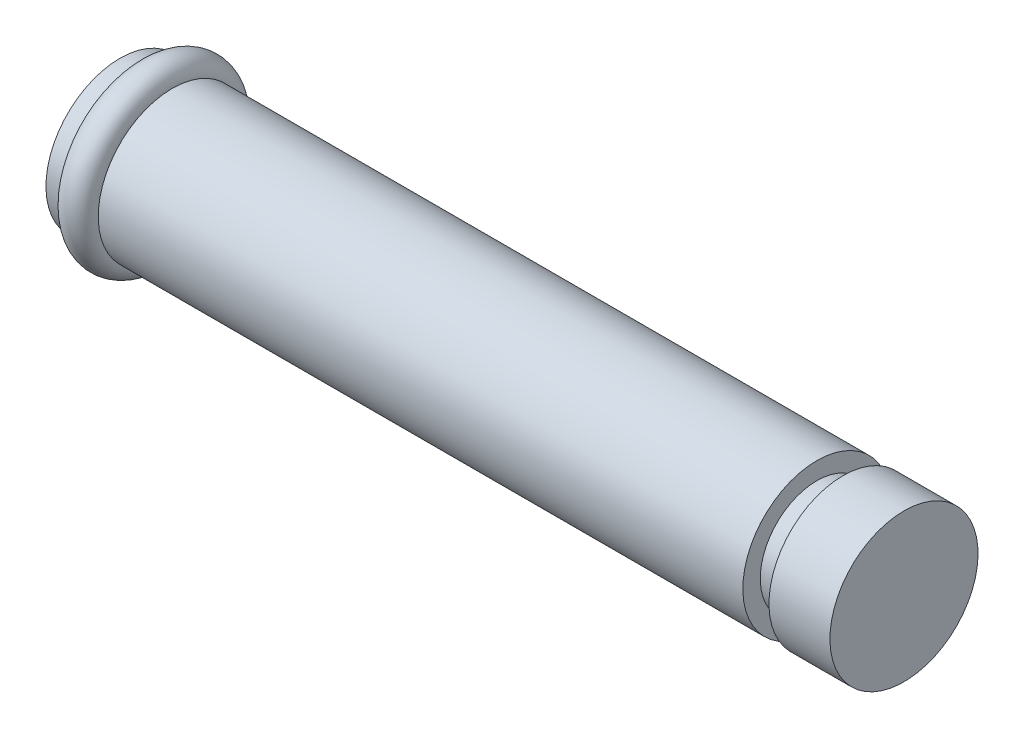
ISO-10303-21;
HEADER;
FILE_DESCRIPTION(('STEP AP214'),'2;1');
FILE_NAME('part.step','',(''),(''),'','','');
FILE_SCHEMA(('AUTOMOTIVE_DESIGN { 1 0 10303 214 1 1 1 1 }'));
ENDSEC;
DATA;
#1=APPLICATION_CONTEXT('core data for automotive mechanical design processes');
#2=APPLICATION_PROTOCOL_DEFINITION('international standard','automotive_design',2000,#1);
#3=PRODUCT_CONTEXT('',#1,'mechanical');
#4=PRODUCT('Part','Part','',(#3));
#5=PRODUCT_RELATED_PRODUCT_CATEGORY('part','',(#4));
#6=PRODUCT_DEFINITION_FORMATION('','',#4);
#7=PRODUCT_DEFINITION_CONTEXT('part definition',#1,'design');
#8=PRODUCT_DEFINITION('design','',#6,#7);
#9=PRODUCT_DEFINITION_SHAPE('','',#8);
#10=(LENGTH_UNIT() NAMED_UNIT(*) SI_UNIT(.MILLI.,.METRE.));
#11=(NAMED_UNIT(*) PLANE_ANGLE_UNIT() SI_UNIT($,.RADIAN.));
#12=(NAMED_UNIT(*) SI_UNIT($,.STERADIAN.) SOLID_ANGLE_UNIT());
#13=UNCERTAINTY_MEASURE_WITH_UNIT(LENGTH_MEASURE(1.E-05),#10,'distance_accuracy_value','');
#14=(GEOMETRIC_REPRESENTATION_CONTEXT(3) GLOBAL_UNCERTAINTY_ASSIGNED_CONTEXT((#13)) GLOBAL_UNIT_ASSIGNED_CONTEXT((#10,
#11,#12)) REPRESENTATION_CONTEXT('',''));
#15=CARTESIAN_POINT('',(0.,0.,0.));
#16=DIRECTION('',(0.,0.,1.));
#17=DIRECTION('',(1.,0.,0.));
#18=AXIS2_PLACEMENT_3D('',#15,#16,#17);
#19=CARTESIAN_POINT('',(-43.05,0.,0.));
#20=DIRECTION('',(-1.,0.,0.));
#21=DIRECTION('',(0.,-1.,0.));
#22=AXIS2_PLACEMENT_3D('',#19,#20,#21);
#23=TOROIDAL_SURFACE('',#22,4.2,0.925000000000002);
#24=CARTESIAN_POINT('',(-43.05,-5.12500000000001,0.));
#25=VERTEX_POINT('',#24);
#26=VERTEX_LOOP('',#25);
#27=FACE_BOUND('',#26,.T.);
#28=ADVANCED_FACE('F45',(#27),#23,.T.);
#29=CLOSED_SHELL('',(#28));
#30=MANIFOLD_SOLID_BREP('B2',#29);
#31=CARTESIAN_POINT('',(0.,0.,0.));
#32=DIRECTION('',(1.,0.,0.));
#33=DIRECTION('',(0.,1.,0.));
#34=AXIS2_PLACEMENT_3D('',#31,#32,#33);
#35=PLANE('',#34);
#36=CARTESIAN_POINT('',(0.,0.,0.));
#37=DIRECTION('',(1.,0.,0.));
#38=DIRECTION('',(0.,1.,0.));
#39=AXIS2_PLACEMENT_3D('',#36,#37,#38);
#40=CIRCLE('',#39,4.25);
#41=CARTESIAN_POINT('',(0.,4.25,0.));
#42=VERTEX_POINT('',#41);
#43=EDGE_CURVE('E44',#42,#42,#40,.T.);
#44=ORIENTED_EDGE('',*,*,#43,.T.);
#45=EDGE_LOOP('',(#44));
#46=FACE_BOUND('',#45,.T.);
#47=ADVANCED_FACE('F58',(#46),#35,.T.);
#48=CARTESIAN_POINT('',(0.,0.,0.));
#49=DIRECTION('',(1.,0.,0.));
#50=DIRECTION('',(0.,1.,0.));
#51=AXIS2_PLACEMENT_3D('',#48,#49,#50);
#52=CYLINDRICAL_SURFACE('',#51,4.25);
#53=CARTESIAN_POINT('',(-3.5,0.,0.));
#54=DIRECTION('',(1.,0.,0.));
#55=DIRECTION('',(0.,1.,0.));
#56=AXIS2_PLACEMENT_3D('',#53,#54,#55);
#57=CIRCLE('',#56,4.25);
#58=CARTESIAN_POINT('',(-3.5,4.25,0.));
#59=VERTEX_POINT('',#58);
#60=EDGE_CURVE('E65',#59,#59,#57,.T.);
#61=ORIENTED_EDGE('',*,*,#60,.T.);
#62=EDGE_LOOP('',(#61));
#63=FACE_BOUND('',#62,.T.);
#64=ORIENTED_EDGE('',*,*,#43,.F.);
#65=EDGE_LOOP('',(#64));
#66=FACE_BOUND('',#65,.T.);
#67=ADVANCED_FACE('F118',(#63,#66),#52,.T.);
#68=CARTESIAN_POINT('',(-3.5,4.25,0.));
#69=DIRECTION('',(-1.,0.,0.));
#70=DIRECTION('',(0.,-1.,0.));
#71=AXIS2_PLACEMENT_3D('',#68,#69,#70);
#72=PLANE('',#71);
#73=CARTESIAN_POINT('',(-3.5,0.,0.));
#74=DIRECTION('',(1.,0.,0.));
#75=DIRECTION('',(0.,1.,0.));
#76=AXIS2_PLACEMENT_3D('',#73,#74,#75);
#77=CIRCLE('',#76,3.25);
#78=CARTESIAN_POINT('',(-3.5,3.25,0.));
#79=VERTEX_POINT('',#78);
#80=EDGE_CURVE('E70',#79,#79,#77,.T.);
#81=ORIENTED_EDGE('',*,*,#80,.T.);
#82=EDGE_LOOP('',(#81));
#83=FACE_BOUND('',#82,.T.);
#84=ORIENTED_EDGE('',*,*,#60,.F.);
#85=EDGE_LOOP('',(#84));
#86=FACE_BOUND('',#85,.T.);
#87=ADVANCED_FACE('F122',(#83,#86),#72,.T.);
#88=CARTESIAN_POINT('',(0.,0.,0.));
#89=DIRECTION('',(1.,0.,0.));
#90=DIRECTION('',(0.,1.,0.));
#91=AXIS2_PLACEMENT_3D('',#88,#89,#90);
#92=CYLINDRICAL_SURFACE('',#91,3.25);
#93=CARTESIAN_POINT('',(-5.,0.,0.));
#94=DIRECTION('',(1.,0.,0.));
#95=DIRECTION('',(0.,1.,0.));
#96=AXIS2_PLACEMENT_3D('',#93,#94,#95);
#97=CIRCLE('',#96,3.25);
#98=CARTESIAN_POINT('',(-5.,3.25,0.));
#99=VERTEX_POINT('',#98);
#100=EDGE_CURVE('E75',#99,#99,#97,.T.);
#101=ORIENTED_EDGE('',*,*,#100,.T.);
#102=EDGE_LOOP('',(#101));
#103=FACE_BOUND('',#102,.T.);
#104=ORIENTED_EDGE('',*,*,#80,.F.);
#105=EDGE_LOOP('',(#104));
#106=FACE_BOUND('',#105,.T.);
#107=ADVANCED_FACE('F126',(#103,#106),#92,.T.);
#108=CARTESIAN_POINT('',(-5.,4.25,0.));
#109=DIRECTION('',(1.,0.,0.));
#110=DIRECTION('',(0.,1.,0.));
#111=AXIS2_PLACEMENT_3D('',#108,#109,#110);
#112=PLANE('',#111);
#113=CARTESIAN_POINT('',(-5.,0.,0.));
#114=DIRECTION('',(1.,0.,0.));
#115=DIRECTION('',(0.,1.,0.));
#116=AXIS2_PLACEMENT_3D('',#113,#114,#115);
#117=CIRCLE('',#116,4.25);
#118=CARTESIAN_POINT('',(-5.,4.25,0.));
#119=VERTEX_POINT('',#118);
#120=EDGE_CURVE('E81',#119,#119,#117,.T.);
#121=ORIENTED_EDGE('',*,*,#120,.T.);
#122=EDGE_LOOP('',(#121));
#123=FACE_BOUND('',#122,.T.);
#124=ORIENTED_EDGE('',*,*,#100,.F.);
#125=EDGE_LOOP('',(#124));
#126=FACE_BOUND('',#125,.T.);
#127=ADVANCED_FACE('F133',(#123,#126),#112,.T.);
#128=CARTESIAN_POINT('',(0.,0.,0.));
#129=DIRECTION('',(1.,0.,0.));
#130=DIRECTION('',(0.,1.,0.));
#131=AXIS2_PLACEMENT_3D('',#128,#129,#130);
#132=CYLINDRICAL_SURFACE('',#131,4.25);
#133=CARTESIAN_POINT('',(-42.,0.,0.));
#134=DIRECTION('',(1.,0.,0.));
#135=DIRECTION('',(0.,1.,0.));
#136=AXIS2_PLACEMENT_3D('',#133,#134,#135);
#137=CIRCLE('',#136,4.25);
#138=CARTESIAN_POINT('',(-42.,4.24999999999999,0.));
#139=VERTEX_POINT('',#138);
#140=EDGE_CURVE('E85',#139,#139,#137,.T.);
#141=ORIENTED_EDGE('',*,*,#140,.T.);
#142=EDGE_LOOP('',(#141));
#143=FACE_BOUND('',#142,.T.);
#144=ORIENTED_EDGE('',*,*,#120,.F.);
#145=EDGE_LOOP('',(#144));
#146=FACE_BOUND('',#145,.T.);
#147=ADVANCED_FACE('F137',(#143,#146),#132,.T.);
#148=CARTESIAN_POINT('',(-42.,4.24999999999999,0.));
#149=DIRECTION('',(-1.,0.,0.));
#150=DIRECTION('',(0.,-1.,0.));
#151=AXIS2_PLACEMENT_3D('',#148,#149,#150);
#152=PLANE('',#151);
#153=CARTESIAN_POINT('',(-42.,0.,0.));
#154=DIRECTION('',(1.,0.,0.));
#155=DIRECTION('',(0.,1.,0.));
#156=AXIS2_PLACEMENT_3D('',#153,#154,#155);
#157=CIRCLE('',#156,3.25);
#158=CARTESIAN_POINT('',(-42.,3.25,0.));
#159=VERTEX_POINT('',#158);
#160=EDGE_CURVE('E89',#159,#159,#157,.T.);
#161=ORIENTED_EDGE('',*,*,#160,.T.);
#162=EDGE_LOOP('',(#161));
#163=FACE_BOUND('',#162,.T.);
#164=ORIENTED_EDGE('',*,*,#140,.F.);
#165=EDGE_LOOP('',(#164));
#166=FACE_BOUND('',#165,.T.);
#167=ADVANCED_FACE('F141',(#163,#166),#152,.T.);
#168=CARTESIAN_POINT('',(0.,0.,0.));
#169=DIRECTION('',(1.,0.,0.));
#170=DIRECTION('',(0.,1.,0.));
#171=AXIS2_PLACEMENT_3D('',#168,#169,#170);
#172=CYLINDRICAL_SURFACE('',#171,3.25);
#173=CARTESIAN_POINT('',(-44.,0.,0.));
#174=DIRECTION('',(1.,0.,0.));
#175=DIRECTION('',(0.,1.,0.));
#176=AXIS2_PLACEMENT_3D('',#173,#174,#175);
#177=CIRCLE('',#176,3.25);
#178=CARTESIAN_POINT('',(-44.,3.25,0.));
#179=VERTEX_POINT('',#178);
#180=EDGE_CURVE('E93',#179,#179,#177,.T.);
#181=ORIENTED_EDGE('',*,*,#180,.T.);
#182=EDGE_LOOP('',(#181));
#183=FACE_BOUND('',#182,.T.);
#184=ORIENTED_EDGE('',*,*,#160,.F.);
#185=EDGE_LOOP('',(#184));
#186=FACE_BOUND('',#185,.T.);
#187=ADVANCED_FACE('F145',(#183,#186),#172,.T.);
#188=CARTESIAN_POINT('',(-44.,4.24999999999999,0.));
#189=DIRECTION('',(1.,0.,0.));
#190=DIRECTION('',(0.,1.,0.));
#191=AXIS2_PLACEMENT_3D('',#188,#189,#190);
#192=PLANE('',#191);
#193=CARTESIAN_POINT('',(-44.,0.,0.));
#194=DIRECTION('',(1.,0.,0.));
#195=DIRECTION('',(0.,1.,0.));
#196=AXIS2_PLACEMENT_3D('',#193,#194,#195);
#197=CIRCLE('',#196,4.25);
#198=CARTESIAN_POINT('',(-44.,4.24999999999999,0.));
#199=VERTEX_POINT('',#198);
#200=EDGE_CURVE('E97',#199,#199,#197,.T.);
#201=ORIENTED_EDGE('',*,*,#200,.T.);
#202=EDGE_LOOP('',(#201));
#203=FACE_BOUND('',#202,.T.);
#204=ORIENTED_EDGE('',*,*,#180,.F.);
#205=EDGE_LOOP('',(#204));
#206=FACE_BOUND('',#205,.T.);
#207=ADVANCED_FACE('F115',(#203,#206),#192,.T.);
#208=CARTESIAN_POINT('',(0.,0.,0.));
#209=DIRECTION('',(1.,0.,0.));
#210=DIRECTION('',(0.,1.,0.));
#211=AXIS2_PLACEMENT_3D('',#208,#209,#210);
#212=CYLINDRICAL_SURFACE('',#211,4.25);
#213=CARTESIAN_POINT('',(-45.,0.,0.));
#214=DIRECTION('',(1.,0.,0.));
#215=DIRECTION('',(0.,1.,0.));
#216=AXIS2_PLACEMENT_3D('',#213,#214,#215);
#217=CIRCLE('',#216,4.25);
#218=CARTESIAN_POINT('',(-45.,4.24999999999999,0.));
#219=VERTEX_POINT('',#218);
#220=EDGE_CURVE('E101',#219,#219,#217,.T.);
#221=ORIENTED_EDGE('',*,*,#220,.T.);
#222=EDGE_LOOP('',(#221));
#223=FACE_BOUND('',#222,.T.);
#224=ORIENTED_EDGE('',*,*,#200,.F.);
#225=EDGE_LOOP('',(#224));
#226=FACE_BOUND('',#225,.T.);
#227=ADVANCED_FACE('F106',(#223,#226),#212,.T.);
#228=CARTESIAN_POINT('',(-45.,0.,0.));
#229=DIRECTION('',(-1.,0.,0.));
#230=DIRECTION('',(0.,-1.,0.));
#231=AXIS2_PLACEMENT_3D('',#228,#229,#230);
#232=PLANE('',#231);
#233=ORIENTED_EDGE('',*,*,#220,.F.);
#234=EDGE_LOOP('',(#233));
#235=FACE_BOUND('',#234,.T.);
#236=ADVANCED_FACE('F109',(#235),#232,.T.);
#237=CLOSED_SHELL('',(#47,#67,#87,#107,#127,#147,#167,#187,#207,#227,#236));
#238=MANIFOLD_SOLID_BREP('B6',#237);
#239=ADVANCED_BREP_SHAPE_REPRESENTATION('',(#18,#30,#238),#14);
#240=SHAPE_DEFINITION_REPRESENTATION(#9,#239);
ENDSEC;
END-ISO-10303-21;
